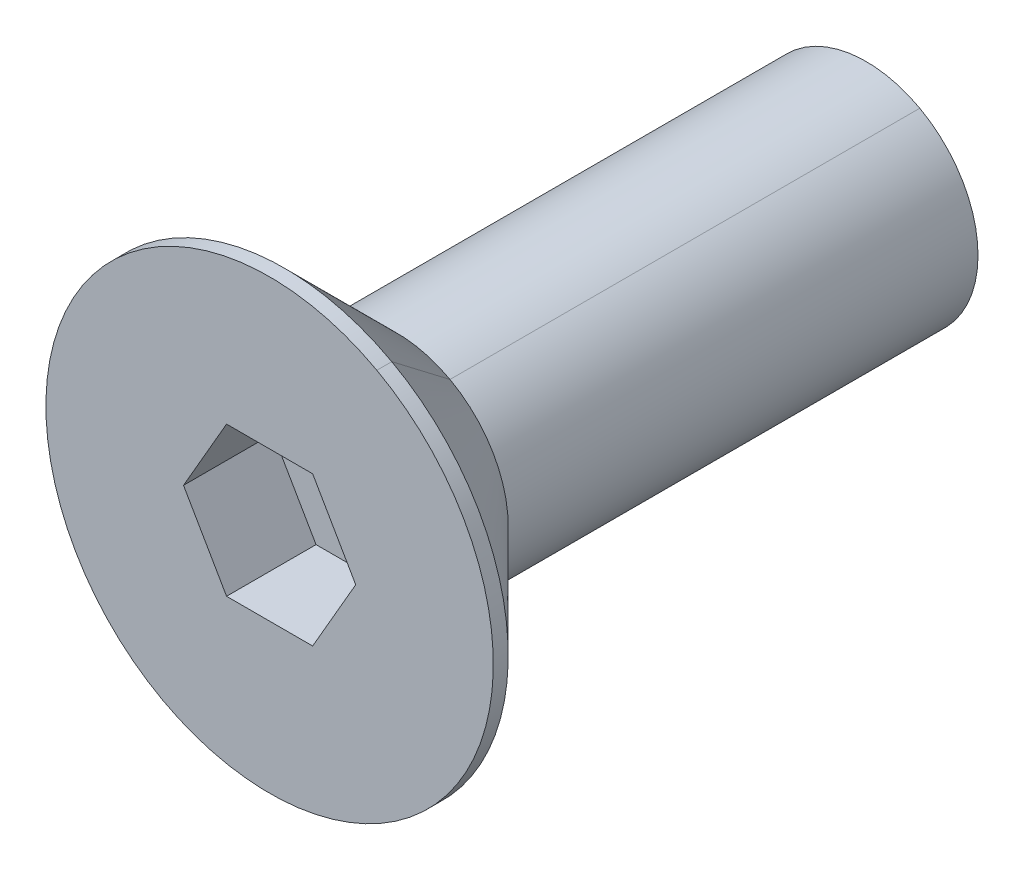
ISO-10303-21;
HEADER;
FILE_DESCRIPTION(('STEP AP214'),'2;1');
FILE_NAME('part.step','',(''),(''),'','','');
FILE_SCHEMA(('AUTOMOTIVE_DESIGN { 1 0 10303 214 1 1 1 1 }'));
ENDSEC;
DATA;
#1=APPLICATION_CONTEXT('core data for automotive mechanical design processes');
#2=APPLICATION_PROTOCOL_DEFINITION('international standard','automotive_design',2000,#1);
#3=PRODUCT_CONTEXT('',#1,'mechanical');
#4=PRODUCT('Part','Part','',(#3));
#5=PRODUCT_RELATED_PRODUCT_CATEGORY('part','',(#4));
#6=PRODUCT_DEFINITION_FORMATION('','',#4);
#7=PRODUCT_DEFINITION_CONTEXT('part definition',#1,'design');
#8=PRODUCT_DEFINITION('design','',#6,#7);
#9=PRODUCT_DEFINITION_SHAPE('','',#8);
#10=(LENGTH_UNIT() NAMED_UNIT(*) SI_UNIT(.MILLI.,.METRE.));
#11=(NAMED_UNIT(*) PLANE_ANGLE_UNIT() SI_UNIT($,.RADIAN.));
#12=(NAMED_UNIT(*) SI_UNIT($,.STERADIAN.) SOLID_ANGLE_UNIT());
#13=UNCERTAINTY_MEASURE_WITH_UNIT(LENGTH_MEASURE(1.E-05),#10,'distance_accuracy_value','');
#14=(GEOMETRIC_REPRESENTATION_CONTEXT(3) GLOBAL_UNCERTAINTY_ASSIGNED_CONTEXT((#13)) GLOBAL_UNIT_ASSIGNED_CONTEXT((#10,
#11,#12)) REPRESENTATION_CONTEXT('',''));
#15=CARTESIAN_POINT('',(0.,0.,0.));
#16=DIRECTION('',(0.,0.,1.));
#17=DIRECTION('',(1.,0.,0.));
#18=AXIS2_PLACEMENT_3D('',#15,#16,#17);
#19=CARTESIAN_POINT('',(-0.57735026919,-1.,8.));
#20=DIRECTION('',(0.,1.,0.));
#21=DIRECTION('',(1.,0.,0.));
#22=AXIS2_PLACEMENT_3D('',#19,#20,#21);
#23=PLANE('',#22);
#24=DIRECTION('',(0.,0.,-1.));
#25=VECTOR('',#24,1.);
#26=CARTESIAN_POINT('',(-0.57735026919,-1.,7.4));
#27=LINE('',#26,#25);
#28=CARTESIAN_POINT('',(-0.57735026919,-1.,8.));
#29=VERTEX_POINT('',#28);
#30=CARTESIAN_POINT('',(-0.57735026919,-1.,6.8));
#31=VERTEX_POINT('',#30);
#32=EDGE_CURVE('E10',#29,#31,#27,.T.);
#33=ORIENTED_EDGE('',*,*,#32,.F.);
#34=DIRECTION('',(1.,0.,0.));
#35=VECTOR('',#34,1.);
#36=CARTESIAN_POINT('',(0.,-1.,8.));
#37=LINE('',#36,#35);
#38=CARTESIAN_POINT('',(0.57735026919,-1.,8.));
#39=VERTEX_POINT('',#38);
#40=EDGE_CURVE('E148',#29,#39,#37,.T.);
#41=ORIENTED_EDGE('',*,*,#40,.T.);
#42=DIRECTION('',(0.,0.,-1.));
#43=VECTOR('',#42,1.);
#44=CARTESIAN_POINT('',(0.57735026919,-1.,7.4));
#45=LINE('',#44,#43);
#46=CARTESIAN_POINT('',(0.57735026919,-1.,6.8));
#47=VERTEX_POINT('',#46);
#48=EDGE_CURVE('E27',#39,#47,#45,.T.);
#49=ORIENTED_EDGE('',*,*,#48,.T.);
#50=DIRECTION('',(1.,0.,0.));
#51=VECTOR('',#50,1.);
#52=CARTESIAN_POINT('',(0.,-1.,6.8));
#53=LINE('',#52,#51);
#54=EDGE_CURVE('E195',#31,#47,#53,.T.);
#55=ORIENTED_EDGE('',*,*,#54,.F.);
#56=EDGE_LOOP('',(#33,#41,#49,#55));
#57=FACE_BOUND('',#56,.T.);
#58=ADVANCED_FACE('F16',(#57),#23,.T.);
#59=CARTESIAN_POINT('',(-1.15470053838,0.,8.));
#60=DIRECTION('',(0.866025403784329,0.50000000000019,0.));
#61=DIRECTION('',(0.,0.,-1.));
#62=AXIS2_PLACEMENT_3D('',#59,#60,#61);
#63=PLANE('',#62);
#64=DIRECTION('',(0.,0.,-1.));
#65=VECTOR('',#64,1.);
#66=CARTESIAN_POINT('',(-1.15470053838,0.,7.4));
#67=LINE('',#66,#65);
#68=CARTESIAN_POINT('',(-1.15470053838,0.,8.));
#69=VERTEX_POINT('',#68);
#70=CARTESIAN_POINT('',(-1.15470053838,0.,6.8));
#71=VERTEX_POINT('',#70);
#72=EDGE_CURVE('E179',#69,#71,#67,.T.);
#73=ORIENTED_EDGE('',*,*,#72,.F.);
#74=DIRECTION('',(0.50000000000019,-0.866025403784329,0.));
#75=VECTOR('',#74,1.);
#76=CARTESIAN_POINT('',(-0.866025403784,-0.5,8.));
#77=LINE('',#76,#75);
#78=EDGE_CURVE('E141',#69,#29,#77,.T.);
#79=ORIENTED_EDGE('',*,*,#78,.T.);
#80=ORIENTED_EDGE('',*,*,#32,.T.);
#81=DIRECTION('',(0.50000000000019,-0.866025403784329,0.));
#82=VECTOR('',#81,1.);
#83=CARTESIAN_POINT('',(-0.866025403784,-0.5,6.8));
#84=LINE('',#83,#82);
#85=EDGE_CURVE('E192',#71,#31,#84,.T.);
#86=ORIENTED_EDGE('',*,*,#85,.F.);
#87=EDGE_LOOP('',(#73,#79,#80,#86));
#88=FACE_BOUND('',#87,.T.);
#89=ADVANCED_FACE('F256',(#88),#63,.T.);
#90=CARTESIAN_POINT('',(0.57735026919,-1.,8.));
#91=DIRECTION('',(-0.866025403784329,0.50000000000019,0.));
#92=DIRECTION('',(0.,0.,1.));
#93=AXIS2_PLACEMENT_3D('',#90,#91,#92);
#94=PLANE('',#93);
#95=ORIENTED_EDGE('',*,*,#48,.F.);
#96=DIRECTION('',(0.50000000000019,0.866025403784329,0.));
#97=VECTOR('',#96,1.);
#98=CARTESIAN_POINT('',(0.866025403784,-0.5,8.));
#99=LINE('',#98,#97);
#100=CARTESIAN_POINT('',(1.15470053838,0.,8.));
#101=VERTEX_POINT('',#100);
#102=EDGE_CURVE('E178',#39,#101,#99,.T.);
#103=ORIENTED_EDGE('',*,*,#102,.T.);
#104=DIRECTION('',(0.,0.,-1.));
#105=VECTOR('',#104,1.);
#106=CARTESIAN_POINT('',(1.15470053838,0.,7.4));
#107=LINE('',#106,#105);
#108=CARTESIAN_POINT('',(1.15470053838,0.,6.8));
#109=VERTEX_POINT('',#108);
#110=EDGE_CURVE('E85',#101,#109,#107,.T.);
#111=ORIENTED_EDGE('',*,*,#110,.T.);
#112=DIRECTION('',(0.50000000000019,0.866025403784329,0.));
#113=VECTOR('',#112,1.);
#114=CARTESIAN_POINT('',(0.866025403784,-0.5,6.8));
#115=LINE('',#114,#113);
#116=EDGE_CURVE('E197',#47,#109,#115,.T.);
#117=ORIENTED_EDGE('',*,*,#116,.F.);
#118=EDGE_LOOP('',(#95,#103,#111,#117));
#119=FACE_BOUND('',#118,.T.);
#120=ADVANCED_FACE('F262',(#119),#94,.T.);
#121=CARTESIAN_POINT('',(0.,0.,6.8));
#122=DIRECTION('',(0.,0.,1.));
#123=DIRECTION('',(1.,0.,0.));
#124=AXIS2_PLACEMENT_3D('',#121,#122,#123);
#125=PLANE('',#124);
#126=DIRECTION('',(-1.,0.,0.));
#127=VECTOR('',#126,1.);
#128=CARTESIAN_POINT('',(0.,1.,6.8));
#129=LINE('',#128,#127);
#130=CARTESIAN_POINT('',(0.57735026919,1.,6.8));
#131=VERTEX_POINT('',#130);
#132=CARTESIAN_POINT('',(-0.57735026919,1.,6.8));
#133=VERTEX_POINT('',#132);
#134=EDGE_CURVE('E126',#131,#133,#129,.T.);
#135=ORIENTED_EDGE('',*,*,#134,.T.);
#136=DIRECTION('',(-0.50000000000019,-0.866025403784329,0.));
#137=VECTOR('',#136,1.);
#138=CARTESIAN_POINT('',(-0.866025403784,0.5,6.8));
#139=LINE('',#138,#137);
#140=EDGE_CURVE('E121',#133,#71,#139,.T.);
#141=ORIENTED_EDGE('',*,*,#140,.T.);
#142=ORIENTED_EDGE('',*,*,#85,.T.);
#143=ORIENTED_EDGE('',*,*,#54,.T.);
#144=ORIENTED_EDGE('',*,*,#116,.T.);
#145=DIRECTION('',(-0.50000000000019,0.866025403784329,0.));
#146=VECTOR('',#145,1.);
#147=CARTESIAN_POINT('',(0.866025403784,0.5,6.8));
#148=LINE('',#147,#146);
#149=EDGE_CURVE('E20',#109,#131,#148,.T.);
#150=ORIENTED_EDGE('',*,*,#149,.T.);
#151=EDGE_LOOP('',(#135,#141,#142,#143,#144,#150));
#152=FACE_BOUND('',#151,.T.);
#153=ADVANCED_FACE('F253',(#152),#125,.T.);
#154=CARTESIAN_POINT('',(-0.57735026919,1.,8.));
#155=DIRECTION('',(0.866025403784329,-0.50000000000019,0.));
#156=DIRECTION('',(0.,0.,-1.));
#157=AXIS2_PLACEMENT_3D('',#154,#155,#156);
#158=PLANE('',#157);
#159=DIRECTION('',(0.,0.,-1.));
#160=VECTOR('',#159,1.);
#161=CARTESIAN_POINT('',(-0.57735026919,1.,7.4));
#162=LINE('',#161,#160);
#163=CARTESIAN_POINT('',(-0.57735026919,1.,8.));
#164=VERTEX_POINT('',#163);
#165=EDGE_CURVE('E113',#164,#133,#162,.T.);
#166=ORIENTED_EDGE('',*,*,#165,.F.);
#167=DIRECTION('',(-0.50000000000019,-0.866025403784329,0.));
#168=VECTOR('',#167,1.);
#169=CARTESIAN_POINT('',(-0.866025403784,0.5,8.));
#170=LINE('',#169,#168);
#171=EDGE_CURVE('E118',#164,#69,#170,.T.);
#172=ORIENTED_EDGE('',*,*,#171,.T.);
#173=ORIENTED_EDGE('',*,*,#72,.T.);
#174=ORIENTED_EDGE('',*,*,#140,.F.);
#175=EDGE_LOOP('',(#166,#172,#173,#174));
#176=FACE_BOUND('',#175,.T.);
#177=ADVANCED_FACE('F115',(#176),#158,.T.);
#178=CARTESIAN_POINT('',(1.15470053838,0.,8.));
#179=DIRECTION('',(-0.866025403784329,-0.50000000000019,0.));
#180=DIRECTION('',(-0.50000000000019,0.866025403784329,0.));
#181=AXIS2_PLACEMENT_3D('',#178,#179,#180);
#182=PLANE('',#181);
#183=ORIENTED_EDGE('',*,*,#110,.F.);
#184=DIRECTION('',(-0.50000000000019,0.866025403784329,0.));
#185=VECTOR('',#184,1.);
#186=CARTESIAN_POINT('',(0.866025403784,0.5,8.));
#187=LINE('',#186,#185);
#188=CARTESIAN_POINT('',(0.57735026919,1.,8.));
#189=VERTEX_POINT('',#188);
#190=EDGE_CURVE('E135',#101,#189,#187,.T.);
#191=ORIENTED_EDGE('',*,*,#190,.T.);
#192=DIRECTION('',(0.,0.,-1.));
#193=VECTOR('',#192,1.);
#194=CARTESIAN_POINT('',(0.57735026919,1.,7.4));
#195=LINE('',#194,#193);
#196=EDGE_CURVE('E127',#189,#131,#195,.T.);
#197=ORIENTED_EDGE('',*,*,#196,.T.);
#198=ORIENTED_EDGE('',*,*,#149,.F.);
#199=EDGE_LOOP('',(#183,#191,#197,#198));
#200=FACE_BOUND('',#199,.T.);
#201=ADVANCED_FACE('F18',(#200),#182,.T.);
#202=CARTESIAN_POINT('',(0.57735026919,1.,8.));
#203=DIRECTION('',(0.,-1.,0.));
#204=DIRECTION('',(0.,0.,-1.));
#205=AXIS2_PLACEMENT_3D('',#202,#203,#204);
#206=PLANE('',#205);
#207=ORIENTED_EDGE('',*,*,#196,.F.);
#208=DIRECTION('',(-1.,0.,0.));
#209=VECTOR('',#208,1.);
#210=CARTESIAN_POINT('',(0.,1.,8.));
#211=LINE('',#210,#209);
#212=EDGE_CURVE('E130',#189,#164,#211,.T.);
#213=ORIENTED_EDGE('',*,*,#212,.T.);
#214=ORIENTED_EDGE('',*,*,#165,.T.);
#215=ORIENTED_EDGE('',*,*,#134,.F.);
#216=EDGE_LOOP('',(#207,#213,#214,#215));
#217=FACE_BOUND('',#216,.T.);
#218=ADVANCED_FACE('F131',(#217),#206,.T.);
#219=CARTESIAN_POINT('',(0.,0.,8.));
#220=DIRECTION('',(0.,0.,-1.));
#221=DIRECTION('',(0.,-1.,0.));
#222=AXIS2_PLACEMENT_3D('',#219,#220,#221);
#223=PLANE('',#222);
#224=ORIENTED_EDGE('',*,*,#102,.F.);
#225=ORIENTED_EDGE('',*,*,#40,.F.);
#226=ORIENTED_EDGE('',*,*,#78,.F.);
#227=ORIENTED_EDGE('',*,*,#171,.F.);
#228=ORIENTED_EDGE('',*,*,#212,.F.);
#229=ORIENTED_EDGE('',*,*,#190,.F.);
#230=EDGE_LOOP('',(#224,#225,#226,#227,#228,#229));
#231=FACE_BOUND('',#230,.T.);
#232=CARTESIAN_POINT('',(0.,0.,8.));
#233=DIRECTION('',(0.,0.,-1.));
#234=DIRECTION('',(1.,0.,0.));
#235=AXIS2_PLACEMENT_3D('',#232,#233,#234);
#236=CIRCLE('',#235,3.);
#237=CARTESIAN_POINT('',(1.43827661581,2.63274768567,8.));
#238=VERTEX_POINT('',#237);
#239=CARTESIAN_POINT('',(-1.43827661581,-2.63274768567,8.));
#240=VERTEX_POINT('',#239);
#241=EDGE_CURVE('E154',#238,#240,#236,.T.);
#242=ORIENTED_EDGE('',*,*,#241,.F.);
#243=CARTESIAN_POINT('',(0.,0.,8.));
#244=DIRECTION('',(0.,0.,-1.));
#245=DIRECTION('',(1.,0.,0.));
#246=AXIS2_PLACEMENT_3D('',#243,#244,#245);
#247=CIRCLE('',#246,3.);
#248=EDGE_CURVE('E201',#240,#238,#247,.T.);
#249=ORIENTED_EDGE('',*,*,#248,.F.);
#250=EDGE_LOOP('',(#242,#249));
#251=FACE_BOUND('',#250,.T.);
#252=ADVANCED_FACE('F138',(#231,#251),#223,.F.);
#253=CARTESIAN_POINT('',(0.,1.5,0.));
#254=DIRECTION('',(0.,0.,-1.));
#255=DIRECTION('',(0.,-1.,0.));
#256=AXIS2_PLACEMENT_3D('',#253,#254,#255);
#257=PLANE('',#256);
#258=CARTESIAN_POINT('',(0.,0.,0.));
#259=DIRECTION('',(0.,0.,-1.));
#260=DIRECTION('',(1.,0.,0.));
#261=AXIS2_PLACEMENT_3D('',#258,#259,#260);
#262=CIRCLE('',#261,1.5);
#263=CARTESIAN_POINT('',(0.719138307906,1.31637384284,0.));
#264=VERTEX_POINT('',#263);
#265=CARTESIAN_POINT('',(-0.719138307906,-1.31637384284,0.));
#266=VERTEX_POINT('',#265);
#267=EDGE_CURVE('E160',#264,#266,#262,.T.);
#268=ORIENTED_EDGE('',*,*,#267,.T.);
#269=CARTESIAN_POINT('',(0.,0.,0.));
#270=DIRECTION('',(0.,0.,-1.));
#271=DIRECTION('',(1.,0.,0.));
#272=AXIS2_PLACEMENT_3D('',#269,#270,#271);
#273=CIRCLE('',#272,1.5);
#274=EDGE_CURVE('E188',#266,#264,#273,.T.);
#275=ORIENTED_EDGE('',*,*,#274,.T.);
#276=EDGE_LOOP('',(#268,#275));
#277=FACE_BOUND('',#276,.T.);
#278=ADVANCED_FACE('F271',(#277),#257,.T.);
#279=CARTESIAN_POINT('',(0.,0.,4.));
#280=DIRECTION('',(0.,0.,-1.));
#281=DIRECTION('',(0.479425538604204,0.877582561890372,0.));
#282=AXIS2_PLACEMENT_3D('',#279,#280,#281);
#283=CYLINDRICAL_SURFACE('',#282,3.);
#284=CARTESIAN_POINT('',(0.,0.,7.8));
#285=DIRECTION('',(0.,0.,-1.));
#286=DIRECTION('',(1.,0.,0.));
#287=AXIS2_PLACEMENT_3D('',#284,#285,#286);
#288=CIRCLE('',#287,3.);
#289=CARTESIAN_POINT('',(-1.43827661581,-2.63274768567,7.8));
#290=VERTEX_POINT('',#289);
#291=CARTESIAN_POINT('',(1.43827661581,2.63274768567,7.8));
#292=VERTEX_POINT('',#291);
#293=EDGE_CURVE('E230',#290,#292,#288,.T.);
#294=ORIENTED_EDGE('',*,*,#293,.F.);
#295=DIRECTION('',(0.,0.,1.));
#296=VECTOR('',#295,1.);
#297=CARTESIAN_POINT('',(-1.43827661581,-2.63274768567,7.9));
#298=LINE('',#297,#296);
#299=EDGE_CURVE('E158',#290,#240,#298,.T.);
#300=ORIENTED_EDGE('',*,*,#299,.T.);
#301=ORIENTED_EDGE('',*,*,#248,.T.);
#302=DIRECTION('',(0.,0.,1.));
#303=VECTOR('',#302,1.);
#304=CARTESIAN_POINT('',(1.43827661581,2.63274768567,7.9));
#305=LINE('',#304,#303);
#306=EDGE_CURVE('E159',#292,#238,#305,.T.);
#307=ORIENTED_EDGE('',*,*,#306,.F.);
#308=EDGE_LOOP('',(#294,#300,#301,#307));
#309=FACE_BOUND('',#308,.T.);
#310=ADVANCED_FACE('F274',(#309),#283,.T.);
#311=CARTESIAN_POINT('',(0.,0.,4.));
#312=DIRECTION('',(0.,0.,-1.));
#313=DIRECTION('',(0.479425538604204,0.877582561890372,0.));
#314=AXIS2_PLACEMENT_3D('',#311,#312,#313);
#315=CYLINDRICAL_SURFACE('',#314,3.);
#316=CARTESIAN_POINT('',(0.,0.,7.8));
#317=DIRECTION('',(0.,0.,-1.));
#318=DIRECTION('',(1.,0.,0.));
#319=AXIS2_PLACEMENT_3D('',#316,#317,#318);
#320=CIRCLE('',#319,3.);
#321=EDGE_CURVE('E164',#292,#290,#320,.T.);
#322=ORIENTED_EDGE('',*,*,#321,.F.);
#323=ORIENTED_EDGE('',*,*,#306,.T.);
#324=ORIENTED_EDGE('',*,*,#241,.T.);
#325=ORIENTED_EDGE('',*,*,#299,.F.);
#326=EDGE_LOOP('',(#322,#323,#324,#325));
#327=FACE_BOUND('',#326,.T.);
#328=ADVANCED_FACE('F278',(#327),#315,.T.);
#329=CARTESIAN_POINT('',(0.,0.,6.3));
#330=DIRECTION('',(0.,0.,1.));
#331=DIRECTION('',(0.479425538604204,0.877582561890372,0.));
#332=AXIS2_PLACEMENT_3D('',#329,#330,#331);
#333=CONICAL_SURFACE('',#332,1.5,0.785398163397);
#334=CARTESIAN_POINT('',(0.,0.,6.3));
#335=DIRECTION('',(0.,0.,-1.));
#336=DIRECTION('',(1.,0.,0.));
#337=AXIS2_PLACEMENT_3D('',#334,#335,#336);
#338=CIRCLE('',#337,1.5);
#339=CARTESIAN_POINT('',(-0.719138307906,-1.31637384284,6.3));
#340=VERTEX_POINT('',#339);
#341=CARTESIAN_POINT('',(0.719138307906,1.31637384284,6.3));
#342=VERTEX_POINT('',#341);
#343=EDGE_CURVE('E173',#340,#342,#338,.T.);
#344=ORIENTED_EDGE('',*,*,#343,.F.);
#345=DIRECTION('',(-0.339005049420843,-0.620544580563713,0.707106781186673));
#346=VECTOR('',#345,1.);
#347=CARTESIAN_POINT('',(-1.07870746186,-1.97456076425,7.05));
#348=LINE('',#347,#346);
#349=EDGE_CURVE('E168',#340,#290,#348,.T.);
#350=ORIENTED_EDGE('',*,*,#349,.T.);
#351=ORIENTED_EDGE('',*,*,#293,.T.);
#352=DIRECTION('',(0.339005049420843,0.620544580563713,0.707106781186673));
#353=VECTOR('',#352,1.);
#354=CARTESIAN_POINT('',(1.07870746186,1.97456076425,7.05));
#355=LINE('',#354,#353);
#356=EDGE_CURVE('E169',#342,#292,#355,.T.);
#357=ORIENTED_EDGE('',*,*,#356,.F.);
#358=EDGE_LOOP('',(#344,#350,#351,#357));
#359=FACE_BOUND('',#358,.T.);
#360=ADVANCED_FACE('F282',(#359),#333,.T.);
#361=CARTESIAN_POINT('',(0.,0.,6.3));
#362=DIRECTION('',(0.,0.,1.));
#363=DIRECTION('',(0.479425538604204,0.877582561890372,0.));
#364=AXIS2_PLACEMENT_3D('',#361,#362,#363);
#365=CONICAL_SURFACE('',#364,1.5,0.785398163397);
#366=CARTESIAN_POINT('',(0.,0.,6.3));
#367=DIRECTION('',(0.,0.,-1.));
#368=DIRECTION('',(1.,0.,0.));
#369=AXIS2_PLACEMENT_3D('',#366,#367,#368);
#370=CIRCLE('',#369,1.5);
#371=EDGE_CURVE('E189',#342,#340,#370,.T.);
#372=ORIENTED_EDGE('',*,*,#371,.F.);
#373=ORIENTED_EDGE('',*,*,#356,.T.);
#374=ORIENTED_EDGE('',*,*,#321,.T.);
#375=ORIENTED_EDGE('',*,*,#349,.F.);
#376=EDGE_LOOP('',(#372,#373,#374,#375));
#377=FACE_BOUND('',#376,.T.);
#378=ADVANCED_FACE('F279',(#377),#365,.T.);
#379=CARTESIAN_POINT('',(0.,0.,4.));
#380=DIRECTION('',(0.,0.,-1.));
#381=DIRECTION('',(0.479425538604204,0.877582561890372,0.));
#382=AXIS2_PLACEMENT_3D('',#379,#380,#381);
#383=CYLINDRICAL_SURFACE('',#382,1.5);
#384=ORIENTED_EDGE('',*,*,#274,.F.);
#385=DIRECTION('',(0.,0.,1.));
#386=VECTOR('',#385,1.);
#387=CARTESIAN_POINT('',(-0.719138307906,-1.31637384284,3.15));
#388=LINE('',#387,#386);
#389=EDGE_CURVE('E184',#266,#340,#388,.T.);
#390=ORIENTED_EDGE('',*,*,#389,.T.);
#391=ORIENTED_EDGE('',*,*,#343,.T.);
#392=DIRECTION('',(0.,0.,1.));
#393=VECTOR('',#392,1.);
#394=CARTESIAN_POINT('',(0.719138307906,1.31637384284,3.15));
#395=LINE('',#394,#393);
#396=EDGE_CURVE('E152',#264,#342,#395,.T.);
#397=ORIENTED_EDGE('',*,*,#396,.F.);
#398=EDGE_LOOP('',(#384,#390,#391,#397));
#399=FACE_BOUND('',#398,.T.);
#400=ADVANCED_FACE('F281',(#399),#383,.T.);
#401=CARTESIAN_POINT('',(0.,0.,4.));
#402=DIRECTION('',(0.,0.,-1.));
#403=DIRECTION('',(0.479425538604204,0.877582561890372,0.));
#404=AXIS2_PLACEMENT_3D('',#401,#402,#403);
#405=CYLINDRICAL_SURFACE('',#404,1.5);
#406=ORIENTED_EDGE('',*,*,#267,.F.);
#407=ORIENTED_EDGE('',*,*,#396,.T.);
#408=ORIENTED_EDGE('',*,*,#371,.T.);
#409=ORIENTED_EDGE('',*,*,#389,.F.);
#410=EDGE_LOOP('',(#406,#407,#408,#409));
#411=FACE_BOUND('',#410,.T.);
#412=ADVANCED_FACE('F267',(#411),#405,.T.);
#413=CLOSED_SHELL('',(#58,#89,#120,#153,#177,#201,#218,#252,#278,#310,#328,#360,#378,#400,#412));
#414=MANIFOLD_SOLID_BREP('B1',#413);
#415=ADVANCED_BREP_SHAPE_REPRESENTATION('',(#18,#414),#14);
#416=SHAPE_DEFINITION_REPRESENTATION(#9,#415);
ENDSEC;
END-ISO-10303-21;
